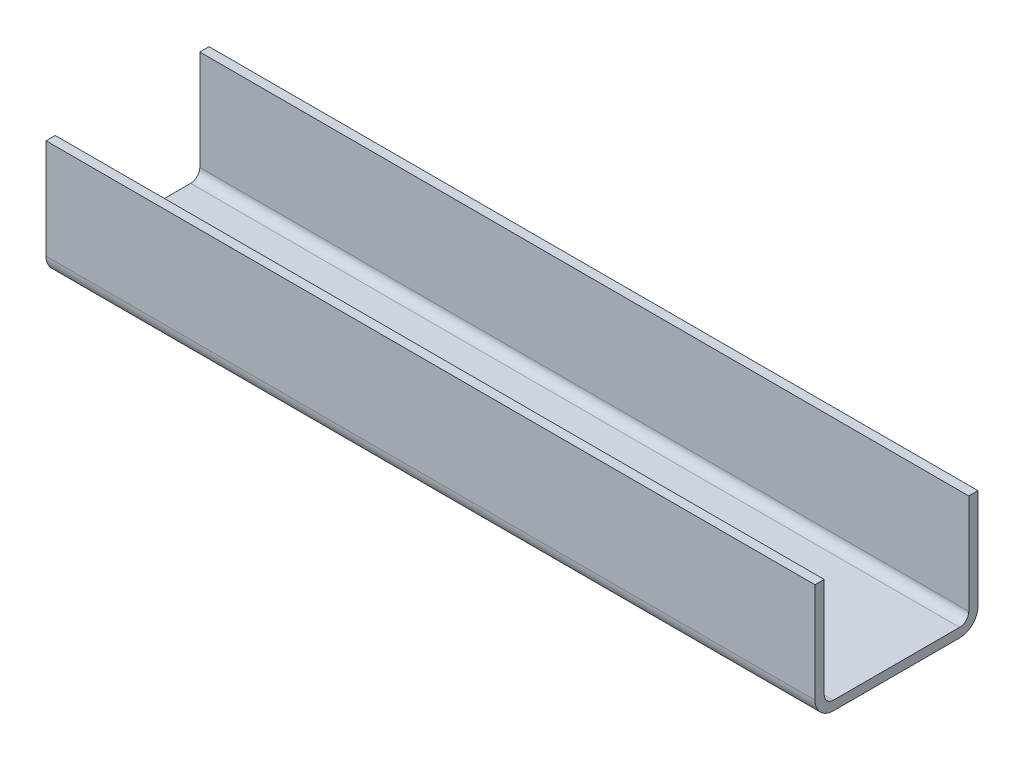
ISO-10303-21;
HEADER;
FILE_DESCRIPTION(('STEP AP214'),'2;1');
FILE_NAME('part.step','',(''),(''),'','','');
FILE_SCHEMA(('AUTOMOTIVE_DESIGN { 1 0 10303 214 1 1 1 1 }'));
ENDSEC;
DATA;
#1=APPLICATION_CONTEXT('core data for automotive mechanical design processes');
#2=APPLICATION_PROTOCOL_DEFINITION('international standard','automotive_design',2000,#1);
#3=PRODUCT_CONTEXT('',#1,'mechanical');
#4=PRODUCT('Part','Part','',(#3));
#5=PRODUCT_RELATED_PRODUCT_CATEGORY('part','',(#4));
#6=PRODUCT_DEFINITION_FORMATION('','',#4);
#7=PRODUCT_DEFINITION_CONTEXT('part definition',#1,'design');
#8=PRODUCT_DEFINITION('design','',#6,#7);
#9=PRODUCT_DEFINITION_SHAPE('','',#8);
#10=(LENGTH_UNIT() NAMED_UNIT(*) SI_UNIT(.MILLI.,.METRE.));
#11=(NAMED_UNIT(*) PLANE_ANGLE_UNIT() SI_UNIT($,.RADIAN.));
#12=(NAMED_UNIT(*) SI_UNIT($,.STERADIAN.) SOLID_ANGLE_UNIT());
#13=UNCERTAINTY_MEASURE_WITH_UNIT(LENGTH_MEASURE(1.E-05),#10,'distance_accuracy_value','');
#14=(GEOMETRIC_REPRESENTATION_CONTEXT(3) GLOBAL_UNCERTAINTY_ASSIGNED_CONTEXT((#13)) GLOBAL_UNIT_ASSIGNED_CONTEXT((#10,
#11,#12)) REPRESENTATION_CONTEXT('',''));
#15=CARTESIAN_POINT('',(0.,0.,0.));
#16=DIRECTION('',(0.,0.,1.));
#17=DIRECTION('',(1.,0.,0.));
#18=AXIS2_PLACEMENT_3D('',#15,#16,#17);
#19=CARTESIAN_POINT('',(125.,6.,-26.5));
#20=DIRECTION('',(0.,0.,1.));
#21=DIRECTION('',(1.,0.,0.));
#22=AXIS2_PLACEMENT_3D('',#19,#20,#21);
#23=PLANE('',#22);
#24=DIRECTION('',(0.,1.,0.));
#25=VECTOR('',#24,1.);
#26=CARTESIAN_POINT('',(-125.,6.,-26.5));
#27=LINE('',#26,#25);
#28=CARTESIAN_POINT('',(-125.,6.,-26.5));
#29=VERTEX_POINT('',#28);
#30=CARTESIAN_POINT('',(-125.,38.5,-26.5));
#31=VERTEX_POINT('',#30);
#32=EDGE_CURVE('E170',#29,#31,#27,.T.);
#33=ORIENTED_EDGE('',*,*,#32,.T.);
#34=DIRECTION('',(-1.,0.,0.));
#35=VECTOR('',#34,1.);
#36=CARTESIAN_POINT('',(125.,38.5,-26.5));
#37=LINE('',#36,#35);
#38=CARTESIAN_POINT('',(125.,38.5,-26.5));
#39=VERTEX_POINT('',#38);
#40=EDGE_CURVE('E11',#39,#31,#37,.T.);
#41=ORIENTED_EDGE('',*,*,#40,.F.);
#42=DIRECTION('',(0.,1.,0.));
#43=VECTOR('',#42,1.);
#44=CARTESIAN_POINT('',(125.,6.,-26.5));
#45=LINE('',#44,#43);
#46=CARTESIAN_POINT('',(125.,6.,-26.5));
#47=VERTEX_POINT('',#46);
#48=EDGE_CURVE('E114',#47,#39,#45,.T.);
#49=ORIENTED_EDGE('',*,*,#48,.F.);
#50=DIRECTION('',(-1.,0.,0.));
#51=VECTOR('',#50,1.);
#52=CARTESIAN_POINT('',(125.,6.,-26.5));
#53=LINE('',#52,#51);
#54=EDGE_CURVE('E166',#47,#29,#53,.T.);
#55=ORIENTED_EDGE('',*,*,#54,.T.);
#56=EDGE_LOOP('',(#33,#41,#49,#55));
#57=FACE_BOUND('',#56,.T.);
#58=ADVANCED_FACE('F45',(#57),#23,.F.);
#59=CARTESIAN_POINT('',(125.,38.5,-23.5));
#60=DIRECTION('',(0.,1.,0.));
#61=DIRECTION('',(0.,0.,1.));
#62=AXIS2_PLACEMENT_3D('',#59,#60,#61);
#63=PLANE('',#62);
#64=DIRECTION('',(0.,0.,-1.));
#65=VECTOR('',#64,1.);
#66=CARTESIAN_POINT('',(-125.,38.5,-23.5));
#67=LINE('',#66,#65);
#68=CARTESIAN_POINT('',(-125.,38.5,-23.5));
#69=VERTEX_POINT('',#68);
#70=EDGE_CURVE('E174',#69,#31,#67,.T.);
#71=ORIENTED_EDGE('',*,*,#70,.F.);
#72=DIRECTION('',(-1.,0.,0.));
#73=VECTOR('',#72,1.);
#74=CARTESIAN_POINT('',(125.,38.5,-23.5));
#75=LINE('',#74,#73);
#76=CARTESIAN_POINT('',(125.,38.5,-23.5));
#77=VERTEX_POINT('',#76);
#78=EDGE_CURVE('E54',#77,#69,#75,.T.);
#79=ORIENTED_EDGE('',*,*,#78,.F.);
#80=DIRECTION('',(0.,0.,-1.));
#81=VECTOR('',#80,1.);
#82=CARTESIAN_POINT('',(125.,38.5,-23.5));
#83=LINE('',#82,#81);
#84=EDGE_CURVE('E257',#77,#39,#83,.T.);
#85=ORIENTED_EDGE('',*,*,#84,.T.);
#86=ORIENTED_EDGE('',*,*,#40,.T.);
#87=EDGE_LOOP('',(#71,#79,#85,#86));
#88=FACE_BOUND('',#87,.T.);
#89=ADVANCED_FACE('F244',(#88),#63,.T.);
#90=CARTESIAN_POINT('',(125.,6.,-23.5));
#91=DIRECTION('',(0.,0.,1.));
#92=DIRECTION('',(1.,0.,0.));
#93=AXIS2_PLACEMENT_3D('',#90,#91,#92);
#94=PLANE('',#93);
#95=DIRECTION('',(0.,1.,0.));
#96=VECTOR('',#95,1.);
#97=CARTESIAN_POINT('',(-125.,6.,-23.5));
#98=LINE('',#97,#96);
#99=CARTESIAN_POINT('',(-125.,6.,-23.5));
#100=VERTEX_POINT('',#99);
#101=EDGE_CURVE('E178',#100,#69,#98,.T.);
#102=ORIENTED_EDGE('',*,*,#101,.F.);
#103=DIRECTION('',(-1.,0.,0.));
#104=VECTOR('',#103,1.);
#105=CARTESIAN_POINT('',(125.,6.,-23.5));
#106=LINE('',#105,#104);
#107=CARTESIAN_POINT('',(125.,6.,-23.5));
#108=VERTEX_POINT('',#107);
#109=EDGE_CURVE('E232',#108,#100,#106,.T.);
#110=ORIENTED_EDGE('',*,*,#109,.F.);
#111=DIRECTION('',(0.,1.,0.));
#112=VECTOR('',#111,1.);
#113=CARTESIAN_POINT('',(125.,6.,-23.5));
#114=LINE('',#113,#112);
#115=EDGE_CURVE('E241',#108,#77,#114,.T.);
#116=ORIENTED_EDGE('',*,*,#115,.T.);
#117=ORIENTED_EDGE('',*,*,#78,.T.);
#118=EDGE_LOOP('',(#102,#110,#116,#117));
#119=FACE_BOUND('',#118,.T.);
#120=ADVANCED_FACE('F239',(#119),#94,.T.);
#121=CARTESIAN_POINT('',(125.,6.,-20.5));
#122=DIRECTION('',(-1.,0.,0.));
#123=DIRECTION('',(0.,0.,1.));
#124=AXIS2_PLACEMENT_3D('',#121,#122,#123);
#125=CYLINDRICAL_SURFACE('',#124,3.);
#126=CARTESIAN_POINT('',(-125.,6.,-20.5));
#127=DIRECTION('',(1.,0.,0.));
#128=DIRECTION('',(0.,0.,-1.));
#129=AXIS2_PLACEMENT_3D('',#126,#127,#128);
#130=CIRCLE('',#129,3.);
#131=CARTESIAN_POINT('',(-125.,3.,-20.5));
#132=VERTEX_POINT('',#131);
#133=EDGE_CURVE('E182',#132,#100,#130,.T.);
#134=ORIENTED_EDGE('',*,*,#133,.F.);
#135=DIRECTION('',(-1.,0.,0.));
#136=VECTOR('',#135,1.);
#137=CARTESIAN_POINT('',(125.,3.,-20.5));
#138=LINE('',#137,#136);
#139=CARTESIAN_POINT('',(125.,3.,-20.5));
#140=VERTEX_POINT('',#139);
#141=EDGE_CURVE('E229',#140,#132,#138,.T.);
#142=ORIENTED_EDGE('',*,*,#141,.F.);
#143=CARTESIAN_POINT('',(125.,6.,-20.5));
#144=DIRECTION('',(1.,0.,0.));
#145=DIRECTION('',(0.,0.,-1.));
#146=AXIS2_PLACEMENT_3D('',#143,#144,#145);
#147=CIRCLE('',#146,3.);
#148=EDGE_CURVE('E254',#140,#108,#147,.T.);
#149=ORIENTED_EDGE('',*,*,#148,.T.);
#150=ORIENTED_EDGE('',*,*,#109,.T.);
#151=EDGE_LOOP('',(#134,#142,#149,#150));
#152=FACE_BOUND('',#151,.T.);
#153=ADVANCED_FACE('F251',(#152),#125,.F.);
#154=CARTESIAN_POINT('',(125.,3.,20.5));
#155=DIRECTION('',(0.,1.,0.));
#156=DIRECTION('',(0.,0.,1.));
#157=AXIS2_PLACEMENT_3D('',#154,#155,#156);
#158=PLANE('',#157);
#159=DIRECTION('',(0.,0.,-1.));
#160=VECTOR('',#159,1.);
#161=CARTESIAN_POINT('',(-125.,3.,20.5));
#162=LINE('',#161,#160);
#163=CARTESIAN_POINT('',(-125.,3.,20.5));
#164=VERTEX_POINT('',#163);
#165=EDGE_CURVE('E186',#164,#132,#162,.T.);
#166=ORIENTED_EDGE('',*,*,#165,.F.);
#167=DIRECTION('',(-1.,0.,0.));
#168=VECTOR('',#167,1.);
#169=CARTESIAN_POINT('',(125.,3.,20.5));
#170=LINE('',#169,#168);
#171=CARTESIAN_POINT('',(125.,3.,20.5));
#172=VERTEX_POINT('',#171);
#173=EDGE_CURVE('E226',#172,#164,#170,.T.);
#174=ORIENTED_EDGE('',*,*,#173,.F.);
#175=DIRECTION('',(0.,0.,-1.));
#176=VECTOR('',#175,1.);
#177=CARTESIAN_POINT('',(125.,3.,20.5));
#178=LINE('',#177,#176);
#179=EDGE_CURVE('E262',#172,#140,#178,.T.);
#180=ORIENTED_EDGE('',*,*,#179,.T.);
#181=ORIENTED_EDGE('',*,*,#141,.T.);
#182=EDGE_LOOP('',(#166,#174,#180,#181));
#183=FACE_BOUND('',#182,.T.);
#184=ADVANCED_FACE('F369',(#183),#158,.T.);
#185=CARTESIAN_POINT('',(125.,6.,20.5));
#186=DIRECTION('',(-1.,0.,0.));
#187=DIRECTION('',(0.,0.,1.));
#188=AXIS2_PLACEMENT_3D('',#185,#186,#187);
#189=CYLINDRICAL_SURFACE('',#188,3.);
#190=CARTESIAN_POINT('',(-125.,6.,20.5));
#191=DIRECTION('',(1.,0.,0.));
#192=DIRECTION('',(0.,0.,-1.));
#193=AXIS2_PLACEMENT_3D('',#190,#191,#192);
#194=CIRCLE('',#193,3.);
#195=CARTESIAN_POINT('',(-125.,6.,23.5));
#196=VERTEX_POINT('',#195);
#197=EDGE_CURVE('E190',#196,#164,#194,.T.);
#198=ORIENTED_EDGE('',*,*,#197,.F.);
#199=DIRECTION('',(-1.,0.,0.));
#200=VECTOR('',#199,1.);
#201=CARTESIAN_POINT('',(125.,6.,23.5));
#202=LINE('',#201,#200);
#203=CARTESIAN_POINT('',(125.,6.,23.5));
#204=VERTEX_POINT('',#203);
#205=EDGE_CURVE('E223',#204,#196,#202,.T.);
#206=ORIENTED_EDGE('',*,*,#205,.F.);
#207=CARTESIAN_POINT('',(125.,6.,20.5));
#208=DIRECTION('',(1.,0.,0.));
#209=DIRECTION('',(0.,0.,-1.));
#210=AXIS2_PLACEMENT_3D('',#207,#208,#209);
#211=CIRCLE('',#210,3.);
#212=EDGE_CURVE('E269',#204,#172,#211,.T.);
#213=ORIENTED_EDGE('',*,*,#212,.T.);
#214=ORIENTED_EDGE('',*,*,#173,.T.);
#215=EDGE_LOOP('',(#198,#206,#213,#214));
#216=FACE_BOUND('',#215,.T.);
#217=ADVANCED_FACE('F360',(#216),#189,.F.);
#218=CARTESIAN_POINT('',(125.,38.5,23.5));
#219=DIRECTION('',(0.,0.,-1.));
#220=DIRECTION('',(-1.,0.,0.));
#221=AXIS2_PLACEMENT_3D('',#218,#219,#220);
#222=PLANE('',#221);
#223=DIRECTION('',(0.,1.,0.));
#224=VECTOR('',#223,1.);
#225=CARTESIAN_POINT('',(-125.,38.5,23.5));
#226=LINE('',#225,#224);
#227=CARTESIAN_POINT('',(-125.,38.5,23.5));
#228=VERTEX_POINT('',#227);
#229=EDGE_CURVE('E194',#228,#196,#226,.F.);
#230=ORIENTED_EDGE('',*,*,#229,.F.);
#231=DIRECTION('',(-1.,0.,0.));
#232=VECTOR('',#231,1.);
#233=CARTESIAN_POINT('',(125.,38.5,23.5));
#234=LINE('',#233,#232);
#235=CARTESIAN_POINT('',(125.,38.5,23.5));
#236=VERTEX_POINT('',#235);
#237=EDGE_CURVE('E220',#236,#228,#234,.T.);
#238=ORIENTED_EDGE('',*,*,#237,.F.);
#239=DIRECTION('',(0.,1.,0.));
#240=VECTOR('',#239,1.);
#241=CARTESIAN_POINT('',(125.,38.5,23.5));
#242=LINE('',#241,#240);
#243=EDGE_CURVE('E273',#236,#204,#242,.F.);
#244=ORIENTED_EDGE('',*,*,#243,.T.);
#245=ORIENTED_EDGE('',*,*,#205,.T.);
#246=EDGE_LOOP('',(#230,#238,#244,#245));
#247=FACE_BOUND('',#246,.T.);
#248=ADVANCED_FACE('F288',(#247),#222,.T.);
#249=CARTESIAN_POINT('',(125.,38.5,26.5));
#250=DIRECTION('',(0.,1.,0.));
#251=DIRECTION('',(0.,0.,1.));
#252=AXIS2_PLACEMENT_3D('',#249,#250,#251);
#253=PLANE('',#252);
#254=DIRECTION('',(0.,0.,-1.));
#255=VECTOR('',#254,1.);
#256=CARTESIAN_POINT('',(-125.,38.5,26.5));
#257=LINE('',#256,#255);
#258=CARTESIAN_POINT('',(-125.,38.5,26.5));
#259=VERTEX_POINT('',#258);
#260=EDGE_CURVE('E198',#259,#228,#257,.T.);
#261=ORIENTED_EDGE('',*,*,#260,.F.);
#262=DIRECTION('',(-1.,0.,0.));
#263=VECTOR('',#262,1.);
#264=CARTESIAN_POINT('',(125.,38.5,26.5));
#265=LINE('',#264,#263);
#266=CARTESIAN_POINT('',(125.,38.5,26.5));
#267=VERTEX_POINT('',#266);
#268=EDGE_CURVE('E217',#267,#259,#265,.T.);
#269=ORIENTED_EDGE('',*,*,#268,.F.);
#270=DIRECTION('',(0.,0.,-1.));
#271=VECTOR('',#270,1.);
#272=CARTESIAN_POINT('',(125.,38.5,26.5));
#273=LINE('',#272,#271);
#274=EDGE_CURVE('E277',#267,#236,#273,.T.);
#275=ORIENTED_EDGE('',*,*,#274,.T.);
#276=ORIENTED_EDGE('',*,*,#237,.T.);
#277=EDGE_LOOP('',(#261,#269,#275,#276));
#278=FACE_BOUND('',#277,.T.);
#279=ADVANCED_FACE('F283',(#278),#253,.T.);
#280=CARTESIAN_POINT('',(125.,38.5,26.5));
#281=DIRECTION('',(0.,0.,-1.));
#282=DIRECTION('',(-1.,0.,0.));
#283=AXIS2_PLACEMENT_3D('',#280,#281,#282);
#284=PLANE('',#283);
#285=DIRECTION('',(0.,1.,0.));
#286=VECTOR('',#285,1.);
#287=CARTESIAN_POINT('',(-125.,38.5,26.5));
#288=LINE('',#287,#286);
#289=CARTESIAN_POINT('',(-125.,6.,26.5));
#290=VERTEX_POINT('',#289);
#291=EDGE_CURVE('E202',#259,#290,#288,.F.);
#292=ORIENTED_EDGE('',*,*,#291,.T.);
#293=DIRECTION('',(-1.,0.,0.));
#294=VECTOR('',#293,1.);
#295=CARTESIAN_POINT('',(125.,6.,26.5));
#296=LINE('',#295,#294);
#297=CARTESIAN_POINT('',(125.,6.,26.5));
#298=VERTEX_POINT('',#297);
#299=EDGE_CURVE('E159',#298,#290,#296,.T.);
#300=ORIENTED_EDGE('',*,*,#299,.F.);
#301=DIRECTION('',(0.,1.,0.));
#302=VECTOR('',#301,1.);
#303=CARTESIAN_POINT('',(125.,38.5,26.5));
#304=LINE('',#303,#302);
#305=EDGE_CURVE('E148',#267,#298,#304,.F.);
#306=ORIENTED_EDGE('',*,*,#305,.F.);
#307=ORIENTED_EDGE('',*,*,#268,.T.);
#308=EDGE_LOOP('',(#292,#300,#306,#307));
#309=FACE_BOUND('',#308,.T.);
#310=ADVANCED_FACE('F292',(#309),#284,.F.);
#311=CARTESIAN_POINT('',(125.,6.,20.5));
#312=DIRECTION('',(-1.,0.,0.));
#313=DIRECTION('',(0.,0.,1.));
#314=AXIS2_PLACEMENT_3D('',#311,#312,#313);
#315=CYLINDRICAL_SURFACE('',#314,6.);
#316=CARTESIAN_POINT('',(-125.,6.,20.5));
#317=DIRECTION('',(1.,0.,0.));
#318=DIRECTION('',(0.,0.,-1.));
#319=AXIS2_PLACEMENT_3D('',#316,#317,#318);
#320=CIRCLE('',#319,6.);
#321=CARTESIAN_POINT('',(-125.,0.,20.5));
#322=VERTEX_POINT('',#321);
#323=EDGE_CURVE('E157',#290,#322,#320,.T.);
#324=ORIENTED_EDGE('',*,*,#323,.T.);
#325=DIRECTION('',(-1.,0.,0.));
#326=VECTOR('',#325,1.);
#327=CARTESIAN_POINT('',(125.,0.,20.5));
#328=LINE('',#327,#326);
#329=CARTESIAN_POINT('',(125.,0.,20.5));
#330=VERTEX_POINT('',#329);
#331=EDGE_CURVE('E154',#330,#322,#328,.T.);
#332=ORIENTED_EDGE('',*,*,#331,.F.);
#333=CARTESIAN_POINT('',(125.,6.,20.5));
#334=DIRECTION('',(1.,0.,0.));
#335=DIRECTION('',(0.,0.,-1.));
#336=AXIS2_PLACEMENT_3D('',#333,#334,#335);
#337=CIRCLE('',#336,6.);
#338=EDGE_CURVE('E141',#298,#330,#337,.T.);
#339=ORIENTED_EDGE('',*,*,#338,.F.);
#340=ORIENTED_EDGE('',*,*,#299,.T.);
#341=EDGE_LOOP('',(#324,#332,#339,#340));
#342=FACE_BOUND('',#341,.T.);
#343=ADVANCED_FACE('F155',(#342),#315,.T.);
#344=CARTESIAN_POINT('',(125.,0.,20.5));
#345=DIRECTION('',(0.,1.,0.));
#346=DIRECTION('',(0.,0.,1.));
#347=AXIS2_PLACEMENT_3D('',#344,#345,#346);
#348=PLANE('',#347);
#349=DIRECTION('',(0.,0.,-1.));
#350=VECTOR('',#349,1.);
#351=CARTESIAN_POINT('',(-125.,0.,20.5));
#352=LINE('',#351,#350);
#353=CARTESIAN_POINT('',(-125.,0.,-20.5));
#354=VERTEX_POINT('',#353);
#355=EDGE_CURVE('E102',#322,#354,#352,.T.);
#356=ORIENTED_EDGE('',*,*,#355,.T.);
#357=DIRECTION('',(-1.,0.,0.));
#358=VECTOR('',#357,1.);
#359=CARTESIAN_POINT('',(125.,0.,-20.5));
#360=LINE('',#359,#358);
#361=CARTESIAN_POINT('',(125.,0.,-20.5));
#362=VERTEX_POINT('',#361);
#363=EDGE_CURVE('E160',#362,#354,#360,.T.);
#364=ORIENTED_EDGE('',*,*,#363,.F.);
#365=DIRECTION('',(0.,0.,-1.));
#366=VECTOR('',#365,1.);
#367=CARTESIAN_POINT('',(125.,0.,20.5));
#368=LINE('',#367,#366);
#369=EDGE_CURVE('E145',#330,#362,#368,.T.);
#370=ORIENTED_EDGE('',*,*,#369,.F.);
#371=ORIENTED_EDGE('',*,*,#331,.T.);
#372=EDGE_LOOP('',(#356,#364,#370,#371));
#373=FACE_BOUND('',#372,.T.);
#374=ADVANCED_FACE('F162',(#373),#348,.F.);
#375=CARTESIAN_POINT('',(125.,6.,-20.5));
#376=DIRECTION('',(-1.,0.,0.));
#377=DIRECTION('',(0.,0.,1.));
#378=AXIS2_PLACEMENT_3D('',#375,#376,#377);
#379=CYLINDRICAL_SURFACE('',#378,6.);
#380=CARTESIAN_POINT('',(-125.,6.,-20.5));
#381=DIRECTION('',(1.,0.,0.));
#382=DIRECTION('',(0.,0.,-1.));
#383=AXIS2_PLACEMENT_3D('',#380,#381,#382);
#384=CIRCLE('',#383,6.);
#385=EDGE_CURVE('E108',#354,#29,#384,.T.);
#386=ORIENTED_EDGE('',*,*,#385,.T.);
#387=ORIENTED_EDGE('',*,*,#54,.F.);
#388=CARTESIAN_POINT('',(125.,6.,-20.5));
#389=DIRECTION('',(1.,0.,0.));
#390=DIRECTION('',(0.,0.,-1.));
#391=AXIS2_PLACEMENT_3D('',#388,#389,#390);
#392=CIRCLE('',#391,6.);
#393=EDGE_CURVE('E62',#362,#47,#392,.T.);
#394=ORIENTED_EDGE('',*,*,#393,.F.);
#395=ORIENTED_EDGE('',*,*,#363,.T.);
#396=EDGE_LOOP('',(#386,#387,#394,#395));
#397=FACE_BOUND('',#396,.T.);
#398=ADVANCED_FACE('F306',(#397),#379,.T.);
#399=CARTESIAN_POINT('',(125.,6.,-20.5));
#400=DIRECTION('',(1.,0.,0.));
#401=DIRECTION('',(0.,0.,-1.));
#402=AXIS2_PLACEMENT_3D('',#399,#400,#401);
#403=PLANE('',#402);
#404=ORIENTED_EDGE('',*,*,#48,.T.);
#405=ORIENTED_EDGE('',*,*,#84,.F.);
#406=ORIENTED_EDGE('',*,*,#115,.F.);
#407=ORIENTED_EDGE('',*,*,#148,.F.);
#408=ORIENTED_EDGE('',*,*,#179,.F.);
#409=ORIENTED_EDGE('',*,*,#212,.F.);
#410=ORIENTED_EDGE('',*,*,#243,.F.);
#411=ORIENTED_EDGE('',*,*,#274,.F.);
#412=ORIENTED_EDGE('',*,*,#305,.T.);
#413=ORIENTED_EDGE('',*,*,#338,.T.);
#414=ORIENTED_EDGE('',*,*,#369,.T.);
#415=ORIENTED_EDGE('',*,*,#393,.T.);
#416=EDGE_LOOP('',(#404,#405,#406,#407,#408,#409,#410,#411,#412,#413,#414,#415));
#417=FACE_BOUND('',#416,.T.);
#418=ADVANCED_FACE('F143',(#417),#403,.T.);
#419=CARTESIAN_POINT('',(-125.,6.,-20.5));
#420=DIRECTION('',(1.,0.,0.));
#421=DIRECTION('',(0.,0.,-1.));
#422=AXIS2_PLACEMENT_3D('',#419,#420,#421);
#423=PLANE('',#422);
#424=ORIENTED_EDGE('',*,*,#32,.F.);
#425=ORIENTED_EDGE('',*,*,#385,.F.);
#426=ORIENTED_EDGE('',*,*,#355,.F.);
#427=ORIENTED_EDGE('',*,*,#323,.F.);
#428=ORIENTED_EDGE('',*,*,#291,.F.);
#429=ORIENTED_EDGE('',*,*,#260,.T.);
#430=ORIENTED_EDGE('',*,*,#229,.T.);
#431=ORIENTED_EDGE('',*,*,#197,.T.);
#432=ORIENTED_EDGE('',*,*,#165,.T.);
#433=ORIENTED_EDGE('',*,*,#133,.T.);
#434=ORIENTED_EDGE('',*,*,#101,.T.);
#435=ORIENTED_EDGE('',*,*,#70,.T.);
#436=EDGE_LOOP('',(#424,#425,#426,#427,#428,#429,#430,#431,#432,#433,#434,#435));
#437=FACE_BOUND('',#436,.T.);
#438=ADVANCED_FACE('F247',(#437),#423,.F.);
#439=CLOSED_SHELL('',(#58,#89,#120,#153,#184,#217,#248,#279,#310,#343,#374,#398,#418,#438));
#440=MANIFOLD_SOLID_BREP('B2',#439);
#441=ADVANCED_BREP_SHAPE_REPRESENTATION('',(#18,#440),#14);
#442=SHAPE_DEFINITION_REPRESENTATION(#9,#441);
ENDSEC;
END-ISO-10303-21;
